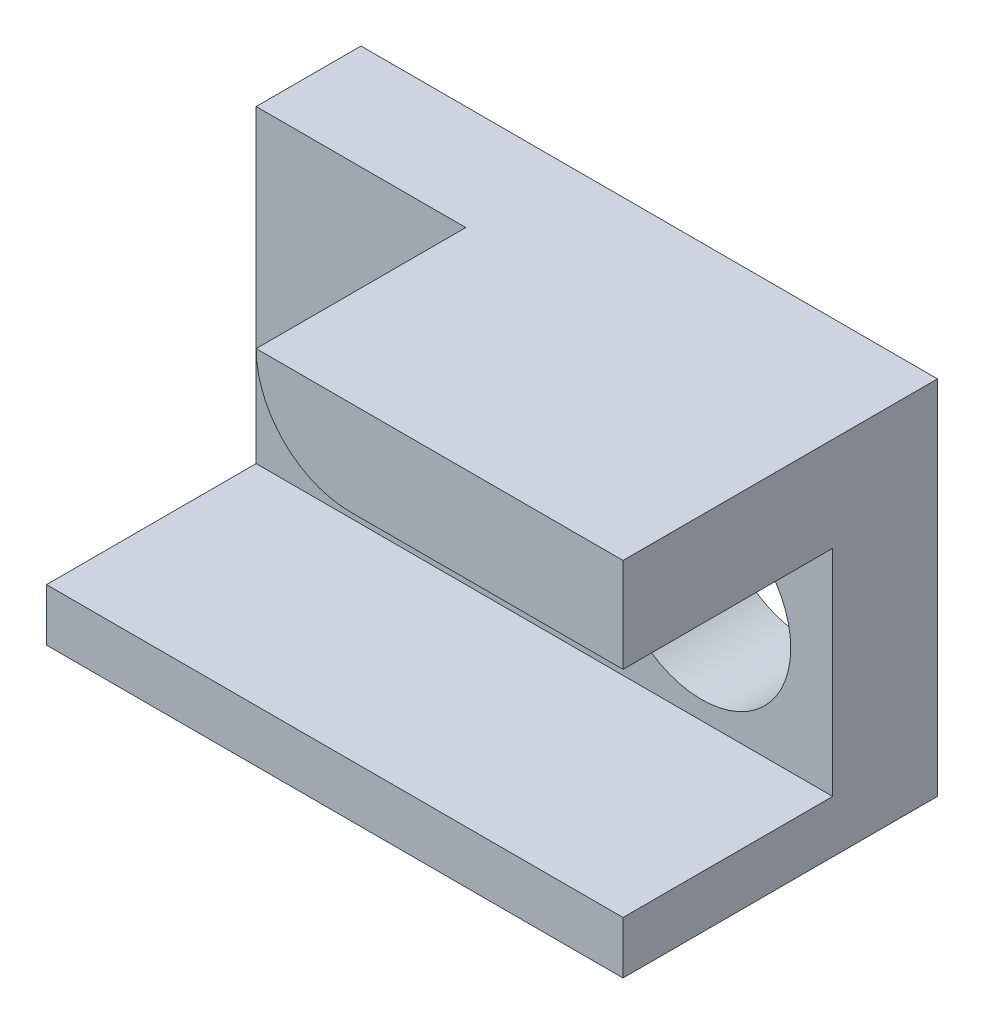
ISO-10303-21;
HEADER;
FILE_DESCRIPTION(('STEP AP214'),'2;1');
FILE_NAME('part.step','',(''),(''),'','','');
FILE_SCHEMA(('AUTOMOTIVE_DESIGN { 1 0 10303 214 1 1 1 1 }'));
ENDSEC;
DATA;
#1=APPLICATION_CONTEXT('core data for automotive mechanical design processes');
#2=APPLICATION_PROTOCOL_DEFINITION('international standard','automotive_design',2000,#1);
#3=PRODUCT_CONTEXT('',#1,'mechanical');
#4=PRODUCT('Part','Part','',(#3));
#5=PRODUCT_RELATED_PRODUCT_CATEGORY('part','',(#4));
#6=PRODUCT_DEFINITION_FORMATION('','',#4);
#7=PRODUCT_DEFINITION_CONTEXT('part definition',#1,'design');
#8=PRODUCT_DEFINITION('design','',#6,#7);
#9=PRODUCT_DEFINITION_SHAPE('','',#8);
#10=(LENGTH_UNIT() NAMED_UNIT(*) SI_UNIT(.MILLI.,.METRE.));
#11=(NAMED_UNIT(*) PLANE_ANGLE_UNIT() SI_UNIT($,.RADIAN.));
#12=(NAMED_UNIT(*) SI_UNIT($,.STERADIAN.) SOLID_ANGLE_UNIT());
#13=UNCERTAINTY_MEASURE_WITH_UNIT(LENGTH_MEASURE(1.E-05),#10,'distance_accuracy_value','');
#14=(GEOMETRIC_REPRESENTATION_CONTEXT(3) GLOBAL_UNCERTAINTY_ASSIGNED_CONTEXT((#13)) GLOBAL_UNIT_ASSIGNED_CONTEXT((#10,
#11,#12)) REPRESENTATION_CONTEXT('',''));
#15=CARTESIAN_POINT('',(0.,0.,0.));
#16=DIRECTION('',(0.,0.,1.));
#17=DIRECTION('',(1.,0.,0.));
#18=AXIS2_PLACEMENT_3D('',#15,#16,#17);
#19=CARTESIAN_POINT('',(0.,0.,0.));
#20=DIRECTION('',(0.,0.,-1.));
#21=DIRECTION('',(-1.,0.,0.));
#22=AXIS2_PLACEMENT_3D('',#19,#20,#21);
#23=PLANE('',#22);
#24=CARTESIAN_POINT('',(-2.5,2.05,0.));
#25=DIRECTION('',(0.,0.,1.));
#26=DIRECTION('',(1.,0.,0.));
#27=AXIS2_PLACEMENT_3D('',#24,#25,#26);
#28=CIRCLE('',#27,1.7);
#29=CARTESIAN_POINT('',(-0.8,2.05,0.));
#30=VERTEX_POINT('',#29);
#31=EDGE_CURVE('E363',#30,#30,#28,.T.);
#32=ORIENTED_EDGE('',*,*,#31,.F.);
#33=EDGE_LOOP('',(#32));
#34=FACE_BOUND('',#33,.T.);
#35=DIRECTION('',(-1.,0.,0.));
#36=VECTOR('',#35,1.);
#37=CARTESIAN_POINT('',(0.,0.,0.));
#38=LINE('',#37,#36);
#39=CARTESIAN_POINT('',(0.,0.,0.));
#40=VERTEX_POINT('',#39);
#41=CARTESIAN_POINT('',(-11.,0.,0.));
#42=VERTEX_POINT('',#41);
#43=EDGE_CURVE('E56',#40,#42,#38,.T.);
#44=ORIENTED_EDGE('',*,*,#43,.F.);
#45=DIRECTION('',(0.,-1.,0.));
#46=VECTOR('',#45,1.);
#47=CARTESIAN_POINT('',(0.,5.9,0.));
#48=LINE('',#47,#46);
#49=CARTESIAN_POINT('',(0.,4.1,0.));
#50=VERTEX_POINT('',#49);
#51=EDGE_CURVE('E160',#50,#40,#48,.T.);
#52=ORIENTED_EDGE('',*,*,#51,.F.);
#53=DIRECTION('',(-1.,0.,0.));
#54=VECTOR('',#53,1.);
#55=CARTESIAN_POINT('',(0.,4.1,0.));
#56=LINE('',#55,#54);
#57=CARTESIAN_POINT('',(-5.19999999999999,4.1,0.));
#58=VERTEX_POINT('',#57);
#59=EDGE_CURVE('E193',#50,#58,#56,.T.);
#60=ORIENTED_EDGE('',*,*,#59,.T.);
#61=CARTESIAN_POINT('',(-5.2,5.9,0.));
#62=DIRECTION('',(0.,0.,1.));
#63=DIRECTION('',(1.,0.,0.));
#64=AXIS2_PLACEMENT_3D('',#61,#62,#63);
#65=CIRCLE('',#64,1.8);
#66=CARTESIAN_POINT('',(-7.,5.90000000000001,0.));
#67=VERTEX_POINT('',#66);
#68=EDGE_CURVE('E188',#58,#67,#65,.F.);
#69=ORIENTED_EDGE('',*,*,#68,.T.);
#70=DIRECTION('',(1.,0.,0.));
#71=VECTOR('',#70,1.);
#72=CARTESIAN_POINT('',(0.,5.9,0.));
#73=LINE('',#72,#71);
#74=CARTESIAN_POINT('',(-11.,5.9,0.));
#75=VERTEX_POINT('',#74);
#76=EDGE_CURVE('E166',#75,#67,#73,.T.);
#77=ORIENTED_EDGE('',*,*,#76,.F.);
#78=DIRECTION('',(0.,1.,0.));
#79=VECTOR('',#78,1.);
#80=CARTESIAN_POINT('',(-11.,5.9,0.));
#81=LINE('',#80,#79);
#82=EDGE_CURVE('E178',#42,#75,#81,.T.);
#83=ORIENTED_EDGE('',*,*,#82,.F.);
#84=EDGE_LOOP('',(#44,#52,#60,#69,#77,#83));
#85=FACE_BOUND('',#84,.T.);
#86=ADVANCED_FACE('F40',(#34,#85),#23,.F.);
#87=CARTESIAN_POINT('',(-5.2,5.9,4.));
#88=DIRECTION('',(0.,0.,-1.));
#89=DIRECTION('',(-1.,0.,0.));
#90=AXIS2_PLACEMENT_3D('',#87,#88,#89);
#91=CYLINDRICAL_SURFACE('',#90,1.8);
#92=ORIENTED_EDGE('',*,*,#68,.F.);
#93=DIRECTION('',(0.,0.,-1.));
#94=VECTOR('',#93,1.);
#95=CARTESIAN_POINT('',(-5.19999999999999,4.1,4.));
#96=LINE('',#95,#94);
#97=CARTESIAN_POINT('',(-5.19999999999999,4.1,4.));
#98=VERTEX_POINT('',#97);
#99=EDGE_CURVE('E11',#98,#58,#96,.T.);
#100=ORIENTED_EDGE('',*,*,#99,.F.);
#101=CARTESIAN_POINT('',(-5.2,5.9,4.));
#102=DIRECTION('',(0.,0.,1.));
#103=DIRECTION('',(1.,0.,0.));
#104=AXIS2_PLACEMENT_3D('',#101,#102,#103);
#105=CIRCLE('',#104,1.8);
#106=CARTESIAN_POINT('',(-7.,5.90000000000001,4.));
#107=VERTEX_POINT('',#106);
#108=EDGE_CURVE('E189',#98,#107,#105,.F.);
#109=ORIENTED_EDGE('',*,*,#108,.T.);
#110=DIRECTION('',(0.,0.,-1.));
#111=VECTOR('',#110,1.);
#112=CARTESIAN_POINT('',(-7.,5.90000000000001,4.));
#113=LINE('',#112,#111);
#114=EDGE_CURVE('E65',#107,#67,#113,.T.);
#115=ORIENTED_EDGE('',*,*,#114,.T.);
#116=EDGE_LOOP('',(#92,#100,#109,#115));
#117=FACE_BOUND('',#116,.T.);
#118=ADVANCED_FACE('F42',(#117),#91,.T.);
#119=CARTESIAN_POINT('',(0.,4.1,4.));
#120=DIRECTION('',(0.,-1.,0.));
#121=DIRECTION('',(0.,0.,-1.));
#122=AXIS2_PLACEMENT_3D('',#119,#120,#121);
#123=PLANE('',#122);
#124=ORIENTED_EDGE('',*,*,#59,.F.);
#125=DIRECTION('',(0.,0.,-1.));
#126=VECTOR('',#125,1.);
#127=CARTESIAN_POINT('',(0.,4.1,4.));
#128=LINE('',#127,#126);
#129=CARTESIAN_POINT('',(0.,4.1,4.));
#130=VERTEX_POINT('',#129);
#131=EDGE_CURVE('E49',#130,#50,#128,.T.);
#132=ORIENTED_EDGE('',*,*,#131,.F.);
#133=DIRECTION('',(-1.,0.,0.));
#134=VECTOR('',#133,1.);
#135=CARTESIAN_POINT('',(0.,4.1,4.));
#136=LINE('',#135,#134);
#137=EDGE_CURVE('E192',#130,#98,#136,.T.);
#138=ORIENTED_EDGE('',*,*,#137,.T.);
#139=ORIENTED_EDGE('',*,*,#99,.T.);
#140=EDGE_LOOP('',(#124,#132,#138,#139));
#141=FACE_BOUND('',#140,.T.);
#142=ADVANCED_FACE('F221',(#141),#123,.T.);
#143=CARTESIAN_POINT('',(0.,0.,4.));
#144=DIRECTION('',(-1.,0.,0.));
#145=DIRECTION('',(0.,0.,1.));
#146=AXIS2_PLACEMENT_3D('',#143,#144,#145);
#147=PLANE('',#146);
#148=ORIENTED_EDGE('',*,*,#131,.T.);
#149=ORIENTED_EDGE('',*,*,#51,.T.);
#150=DIRECTION('',(0.,0.,-1.));
#151=VECTOR('',#150,1.);
#152=CARTESIAN_POINT('',(0.,0.,4.));
#153=LINE('',#152,#151);
#154=CARTESIAN_POINT('',(0.,0.,4.));
#155=VERTEX_POINT('',#154);
#156=EDGE_CURVE('E157',#155,#40,#153,.T.);
#157=ORIENTED_EDGE('',*,*,#156,.F.);
#158=DIRECTION('',(0.,-1.,0.));
#159=VECTOR('',#158,1.);
#160=CARTESIAN_POINT('',(0.,0.,4.));
#161=LINE('',#160,#159);
#162=CARTESIAN_POINT('',(0.,-1.,4.));
#163=VERTEX_POINT('',#162);
#164=EDGE_CURVE('E143',#155,#163,#161,.T.);
#165=ORIENTED_EDGE('',*,*,#164,.T.);
#166=DIRECTION('',(0.,0.,1.));
#167=VECTOR('',#166,1.);
#168=CARTESIAN_POINT('',(0.,-1.,-2.));
#169=LINE('',#168,#167);
#170=CARTESIAN_POINT('',(0.,-1.,-2.));
#171=VERTEX_POINT('',#170);
#172=EDGE_CURVE('E127',#171,#163,#169,.T.);
#173=ORIENTED_EDGE('',*,*,#172,.F.);
#174=DIRECTION('',(0.,-1.,0.));
#175=VECTOR('',#174,1.);
#176=CARTESIAN_POINT('',(0.,5.9,-2.));
#177=LINE('',#176,#175);
#178=CARTESIAN_POINT('',(0.,5.9,-2.));
#179=VERTEX_POINT('',#178);
#180=EDGE_CURVE('E161',#179,#171,#177,.T.);
#181=ORIENTED_EDGE('',*,*,#180,.F.);
#182=DIRECTION('',(0.,0.,-1.));
#183=VECTOR('',#182,1.);
#184=CARTESIAN_POINT('',(0.,5.9,4.));
#185=LINE('',#184,#183);
#186=CARTESIAN_POINT('',(0.,5.9,4.));
#187=VERTEX_POINT('',#186);
#188=EDGE_CURVE('E210',#187,#179,#185,.T.);
#189=ORIENTED_EDGE('',*,*,#188,.F.);
#190=DIRECTION('',(0.,1.,0.));
#191=VECTOR('',#190,1.);
#192=CARTESIAN_POINT('',(0.,0.,4.));
#193=LINE('',#192,#191);
#194=EDGE_CURVE('E197',#130,#187,#193,.T.);
#195=ORIENTED_EDGE('',*,*,#194,.F.);
#196=EDGE_LOOP('',(#148,#149,#157,#165,#173,#181,#189,#195));
#197=FACE_BOUND('',#196,.T.);
#198=ADVANCED_FACE('F216',(#197),#147,.F.);
#199=CARTESIAN_POINT('',(0.,5.9,4.));
#200=DIRECTION('',(0.,1.,0.));
#201=DIRECTION('',(-1.,0.,0.));
#202=AXIS2_PLACEMENT_3D('',#199,#200,#201);
#203=PLANE('',#202);
#204=ORIENTED_EDGE('',*,*,#188,.T.);
#205=DIRECTION('',(1.,0.,0.));
#206=VECTOR('',#205,1.);
#207=CARTESIAN_POINT('',(0.,5.9,-2.));
#208=LINE('',#207,#206);
#209=CARTESIAN_POINT('',(-11.,5.9,-2.));
#210=VERTEX_POINT('',#209);
#211=EDGE_CURVE('E171',#210,#179,#208,.T.);
#212=ORIENTED_EDGE('',*,*,#211,.F.);
#213=DIRECTION('',(0.,0.,1.));
#214=VECTOR('',#213,1.);
#215=CARTESIAN_POINT('',(-11.,5.9,-2.));
#216=LINE('',#215,#214);
#217=EDGE_CURVE('E128',#210,#75,#216,.T.);
#218=ORIENTED_EDGE('',*,*,#217,.T.);
#219=ORIENTED_EDGE('',*,*,#76,.T.);
#220=ORIENTED_EDGE('',*,*,#114,.F.);
#221=DIRECTION('',(1.,0.,0.));
#222=VECTOR('',#221,1.);
#223=CARTESIAN_POINT('',(0.,5.9,4.));
#224=LINE('',#223,#222);
#225=EDGE_CURVE('E200',#107,#187,#224,.T.);
#226=ORIENTED_EDGE('',*,*,#225,.T.);
#227=EDGE_LOOP('',(#204,#212,#218,#219,#220,#226));
#228=FACE_BOUND('',#227,.T.);
#229=ADVANCED_FACE('F226',(#228),#203,.T.);
#230=CARTESIAN_POINT('',(0.,0.,4.));
#231=DIRECTION('',(0.,0.,1.));
#232=DIRECTION('',(1.,0.,0.));
#233=AXIS2_PLACEMENT_3D('',#230,#231,#232);
#234=PLANE('',#233);
#235=ORIENTED_EDGE('',*,*,#108,.F.);
#236=ORIENTED_EDGE('',*,*,#137,.F.);
#237=ORIENTED_EDGE('',*,*,#194,.T.);
#238=ORIENTED_EDGE('',*,*,#225,.F.);
#239=EDGE_LOOP('',(#235,#236,#237,#238));
#240=FACE_BOUND('',#239,.T.);
#241=ADVANCED_FACE('F253',(#240),#234,.T.);
#242=CARTESIAN_POINT('',(0.,-1.,-2.));
#243=DIRECTION('',(0.,1.,0.));
#244=DIRECTION('',(0.,0.,1.));
#245=AXIS2_PLACEMENT_3D('',#242,#243,#244);
#246=PLANE('',#245);
#247=ORIENTED_EDGE('',*,*,#172,.T.);
#248=DIRECTION('',(-1.,0.,0.));
#249=VECTOR('',#248,1.);
#250=CARTESIAN_POINT('',(0.,-1.,4.));
#251=LINE('',#250,#249);
#252=CARTESIAN_POINT('',(-11.,-1.,4.));
#253=VERTEX_POINT('',#252);
#254=EDGE_CURVE('E134',#163,#253,#251,.T.);
#255=ORIENTED_EDGE('',*,*,#254,.T.);
#256=DIRECTION('',(0.,0.,1.));
#257=VECTOR('',#256,1.);
#258=CARTESIAN_POINT('',(-11.,-1.,-2.));
#259=LINE('',#258,#257);
#260=CARTESIAN_POINT('',(-11.,-1.,-2.));
#261=VERTEX_POINT('',#260);
#262=EDGE_CURVE('E118',#261,#253,#259,.T.);
#263=ORIENTED_EDGE('',*,*,#262,.F.);
#264=DIRECTION('',(-1.,0.,0.));
#265=VECTOR('',#264,1.);
#266=CARTESIAN_POINT('',(0.,-1.,-2.));
#267=LINE('',#266,#265);
#268=EDGE_CURVE('E165',#171,#261,#267,.T.);
#269=ORIENTED_EDGE('',*,*,#268,.F.);
#270=EDGE_LOOP('',(#247,#255,#263,#269));
#271=FACE_BOUND('',#270,.T.);
#272=ADVANCED_FACE('F140',(#271),#246,.F.);
#273=CARTESIAN_POINT('',(-11.,5.9,-2.));
#274=DIRECTION('',(1.,0.,0.));
#275=DIRECTION('',(0.,0.,-1.));
#276=AXIS2_PLACEMENT_3D('',#273,#274,#275);
#277=PLANE('',#276);
#278=ORIENTED_EDGE('',*,*,#262,.T.);
#279=DIRECTION('',(0.,1.,0.));
#280=VECTOR('',#279,1.);
#281=CARTESIAN_POINT('',(-11.,0.,4.));
#282=LINE('',#281,#280);
#283=CARTESIAN_POINT('',(-11.,0.,4.));
#284=VERTEX_POINT('',#283);
#285=EDGE_CURVE('E121',#253,#284,#282,.T.);
#286=ORIENTED_EDGE('',*,*,#285,.T.);
#287=DIRECTION('',(0.,0.,-1.));
#288=VECTOR('',#287,1.);
#289=CARTESIAN_POINT('',(-11.,0.,4.));
#290=LINE('',#289,#288);
#291=EDGE_CURVE('E151',#284,#42,#290,.T.);
#292=ORIENTED_EDGE('',*,*,#291,.T.);
#293=ORIENTED_EDGE('',*,*,#82,.T.);
#294=ORIENTED_EDGE('',*,*,#217,.F.);
#295=DIRECTION('',(0.,1.,0.));
#296=VECTOR('',#295,1.);
#297=CARTESIAN_POINT('',(-11.,5.9,-2.));
#298=LINE('',#297,#296);
#299=EDGE_CURVE('E123',#261,#210,#298,.T.);
#300=ORIENTED_EDGE('',*,*,#299,.F.);
#301=EDGE_LOOP('',(#278,#286,#292,#293,#294,#300));
#302=FACE_BOUND('',#301,.T.);
#303=ADVANCED_FACE('F120',(#302),#277,.F.);
#304=CARTESIAN_POINT('',(0.,0.,-2.));
#305=DIRECTION('',(0.,0.,-1.));
#306=DIRECTION('',(-1.,0.,0.));
#307=AXIS2_PLACEMENT_3D('',#304,#305,#306);
#308=PLANE('',#307);
#309=CARTESIAN_POINT('',(-2.5,2.05,-2.));
#310=DIRECTION('',(0.,0.,1.));
#311=DIRECTION('',(1.,0.,0.));
#312=AXIS2_PLACEMENT_3D('',#309,#310,#311);
#313=CIRCLE('',#312,1.7);
#314=CARTESIAN_POINT('',(-0.8,2.05,-2.));
#315=VERTEX_POINT('',#314);
#316=EDGE_CURVE('E154',#315,#315,#313,.T.);
#317=ORIENTED_EDGE('',*,*,#316,.T.);
#318=EDGE_LOOP('',(#317));
#319=FACE_BOUND('',#318,.T.);
#320=ORIENTED_EDGE('',*,*,#180,.T.);
#321=ORIENTED_EDGE('',*,*,#268,.T.);
#322=ORIENTED_EDGE('',*,*,#299,.T.);
#323=ORIENTED_EDGE('',*,*,#211,.T.);
#324=EDGE_LOOP('',(#320,#321,#322,#323));
#325=FACE_BOUND('',#324,.T.);
#326=ADVANCED_FACE('F229',(#319,#325),#308,.T.);
#327=CARTESIAN_POINT('',(0.,0.,4.));
#328=DIRECTION('',(0.,-1.,0.));
#329=DIRECTION('',(0.,0.,-1.));
#330=AXIS2_PLACEMENT_3D('',#327,#328,#329);
#331=PLANE('',#330);
#332=ORIENTED_EDGE('',*,*,#43,.T.);
#333=ORIENTED_EDGE('',*,*,#291,.F.);
#334=DIRECTION('',(-1.,0.,0.));
#335=VECTOR('',#334,1.);
#336=CARTESIAN_POINT('',(0.,0.,4.));
#337=LINE('',#336,#335);
#338=EDGE_CURVE('E137',#155,#284,#337,.T.);
#339=ORIENTED_EDGE('',*,*,#338,.F.);
#340=ORIENTED_EDGE('',*,*,#156,.T.);
#341=EDGE_LOOP('',(#332,#333,#339,#340));
#342=FACE_BOUND('',#341,.T.);
#343=ADVANCED_FACE('F230',(#342),#331,.F.);
#344=CARTESIAN_POINT('',(0.,0.,4.));
#345=DIRECTION('',(0.,0.,1.));
#346=DIRECTION('',(1.,0.,0.));
#347=AXIS2_PLACEMENT_3D('',#344,#345,#346);
#348=PLANE('',#347);
#349=ORIENTED_EDGE('',*,*,#285,.F.);
#350=ORIENTED_EDGE('',*,*,#254,.F.);
#351=ORIENTED_EDGE('',*,*,#164,.F.);
#352=ORIENTED_EDGE('',*,*,#338,.T.);
#353=EDGE_LOOP('',(#349,#350,#351,#352));
#354=FACE_BOUND('',#353,.T.);
#355=ADVANCED_FACE('F132',(#354),#348,.T.);
#356=CARTESIAN_POINT('',(-2.5,2.05,-2.));
#357=DIRECTION('',(0.,0.,1.));
#358=DIRECTION('',(1.,0.,0.));
#359=AXIS2_PLACEMENT_3D('',#356,#357,#358);
#360=CYLINDRICAL_SURFACE('',#359,1.7);
#361=ORIENTED_EDGE('',*,*,#316,.F.);
#362=EDGE_LOOP('',(#361));
#363=FACE_BOUND('',#362,.T.);
#364=ORIENTED_EDGE('',*,*,#31,.T.);
#365=EDGE_LOOP('',(#364));
#366=FACE_BOUND('',#365,.T.);
#367=ADVANCED_FACE('F237',(#363,#366),#360,.F.);
#368=CLOSED_SHELL('',(#86,#118,#142,#198,#229,#241,#272,#303,#326,#343,#355,#367));
#369=MANIFOLD_SOLID_BREP('B2',#368);
#370=ADVANCED_BREP_SHAPE_REPRESENTATION('',(#18,#369),#14);
#371=SHAPE_DEFINITION_REPRESENTATION(#9,#370);
ENDSEC;
END-ISO-10303-21;
